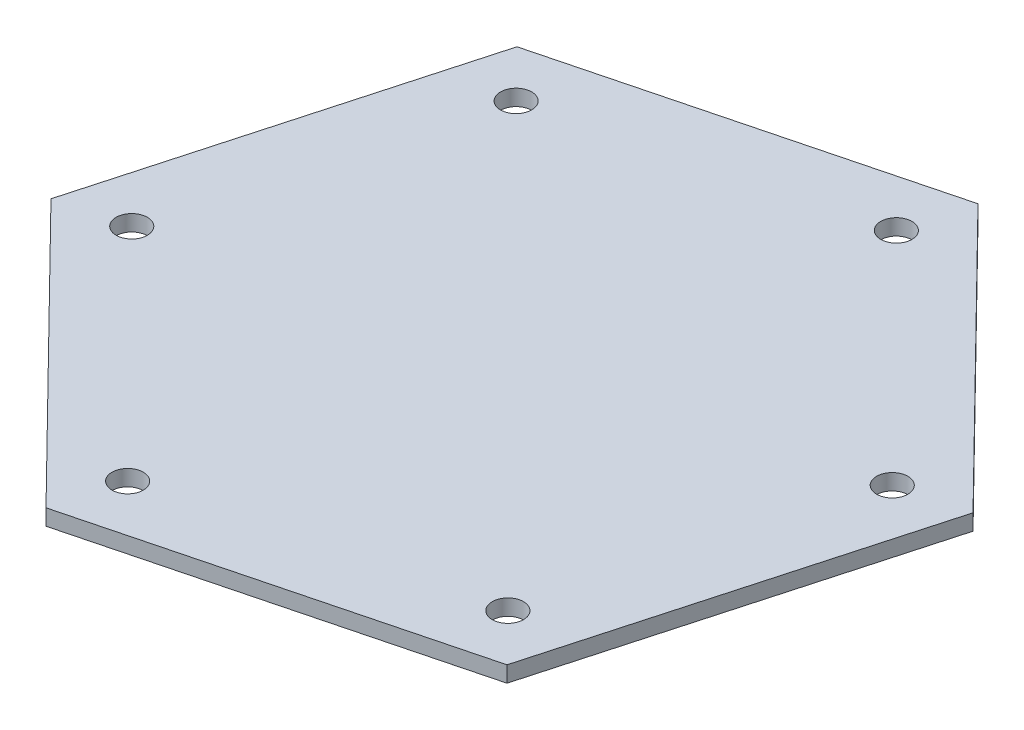
ISO-10303-21;
HEADER;
FILE_DESCRIPTION(('STEP AP214'),'2;1');
FILE_NAME('part.step','',(''),(''),'','','');
FILE_SCHEMA(('AUTOMOTIVE_DESIGN { 1 0 10303 214 1 1 1 1 }'));
ENDSEC;
DATA;
#1=APPLICATION_CONTEXT('core data for automotive mechanical design processes');
#2=APPLICATION_PROTOCOL_DEFINITION('international standard','automotive_design',2000,#1);
#3=PRODUCT_CONTEXT('',#1,'mechanical');
#4=PRODUCT('Part','Part','',(#3));
#5=PRODUCT_RELATED_PRODUCT_CATEGORY('part','',(#4));
#6=PRODUCT_DEFINITION_FORMATION('','',#4);
#7=PRODUCT_DEFINITION_CONTEXT('part definition',#1,'design');
#8=PRODUCT_DEFINITION('design','',#6,#7);
#9=PRODUCT_DEFINITION_SHAPE('','',#8);
#10=(LENGTH_UNIT() NAMED_UNIT(*) SI_UNIT(.MILLI.,.METRE.));
#11=(NAMED_UNIT(*) PLANE_ANGLE_UNIT() SI_UNIT($,.RADIAN.));
#12=(NAMED_UNIT(*) SI_UNIT($,.STERADIAN.) SOLID_ANGLE_UNIT());
#13=UNCERTAINTY_MEASURE_WITH_UNIT(LENGTH_MEASURE(1.E-05),#10,'distance_accuracy_value','');
#14=(GEOMETRIC_REPRESENTATION_CONTEXT(3) GLOBAL_UNCERTAINTY_ASSIGNED_CONTEXT((#13)) GLOBAL_UNIT_ASSIGNED_CONTEXT((#10,
#11,#12)) REPRESENTATION_CONTEXT('',''));
#15=CARTESIAN_POINT('',(0.,0.,0.));
#16=DIRECTION('',(0.,0.,1.));
#17=DIRECTION('',(1.,0.,0.));
#18=AXIS2_PLACEMENT_3D('',#15,#16,#17);
#19=CARTESIAN_POINT('',(-8.24691095097219,1.3,29.6710913140507));
#20=DIRECTION('',(-0.249822879818475,0.,-0.968291551506675));
#21=DIRECTION('',(-0.968291551506675,0.,0.249822879818475));
#22=AXIS2_PLACEMENT_3D('',#19,#20,#21);
#23=PLANE('',#22);
#24=DIRECTION('',(0.968291551506675,0.,-0.249822879818475));
#25=VECTOR('',#24,1.);
#26=CARTESIAN_POINT('',(-8.24691095097219,0.,29.6710913140507));
#27=LINE('',#26,#25);
#28=CARTESIAN_POINT('',(-8.24691095097219,0.,29.6710913140507));
#29=VERTEX_POINT('',#28);
#30=CARTESIAN_POINT('',(21.5724633604896,0.,21.9775800433153));
#31=VERTEX_POINT('',#30);
#32=EDGE_CURVE('E118',#29,#31,#27,.T.);
#33=ORIENTED_EDGE('',*,*,#32,.T.);
#34=DIRECTION('',(0.,-1.,0.));
#35=VECTOR('',#34,1.);
#36=CARTESIAN_POINT('',(21.5724633604896,1.3,21.9775800433153));
#37=LINE('',#36,#35);
#38=CARTESIAN_POINT('',(21.5724633604896,1.3,21.9775800433153));
#39=VERTEX_POINT('',#38);
#40=EDGE_CURVE('E11',#39,#31,#37,.T.);
#41=ORIENTED_EDGE('',*,*,#40,.F.);
#42=DIRECTION('',(0.968291551506675,0.,-0.249822879818475));
#43=VECTOR('',#42,1.);
#44=CARTESIAN_POINT('',(-8.24691095097219,1.3,29.6710913140507));
#45=LINE('',#44,#43);
#46=CARTESIAN_POINT('',(-8.24691095097219,1.3,29.6710913140507));
#47=VERTEX_POINT('',#46);
#48=EDGE_CURVE('E129',#47,#39,#45,.T.);
#49=ORIENTED_EDGE('',*,*,#48,.F.);
#50=DIRECTION('',(0.,-1.,0.));
#51=VECTOR('',#50,1.);
#52=CARTESIAN_POINT('',(-8.24691095097219,1.3,29.6710913140507));
#53=LINE('',#52,#51);
#54=EDGE_CURVE('E114',#47,#29,#53,.T.);
#55=ORIENTED_EDGE('',*,*,#54,.T.);
#56=EDGE_LOOP('',(#33,#41,#49,#55));
#57=FACE_BOUND('',#56,.T.);
#58=ADVANCED_FACE('F34',(#57),#23,.F.);
#59=CARTESIAN_POINT('',(21.5724633604896,1.3,21.9775800433153));
#60=DIRECTION('',(-0.963476521783866,0.,-0.267792815383952));
#61=DIRECTION('',(-0.267792815383952,0.,0.963476521783866));
#62=AXIS2_PLACEMENT_3D('',#59,#60,#61);
#63=PLANE('',#62);
#64=DIRECTION('',(0.267792815383952,0.,-0.963476521783866));
#65=VECTOR('',#64,1.);
#66=CARTESIAN_POINT('',(21.5724633604896,0.,21.9775800433153));
#67=LINE('',#66,#65);
#68=CARTESIAN_POINT('',(29.8193743114618,0.,-7.69351127073536));
#69=VERTEX_POINT('',#68);
#70=EDGE_CURVE('E121',#31,#69,#67,.T.);
#71=ORIENTED_EDGE('',*,*,#70,.T.);
#72=DIRECTION('',(0.,-1.,0.));
#73=VECTOR('',#72,1.);
#74=CARTESIAN_POINT('',(29.8193743114618,1.3,-7.69351127073536));
#75=LINE('',#74,#73);
#76=CARTESIAN_POINT('',(29.8193743114618,1.3,-7.69351127073536));
#77=VERTEX_POINT('',#76);
#78=EDGE_CURVE('E42',#77,#69,#75,.T.);
#79=ORIENTED_EDGE('',*,*,#78,.F.);
#80=DIRECTION('',(0.267792815383952,0.,-0.963476521783866));
#81=VECTOR('',#80,1.);
#82=CARTESIAN_POINT('',(21.5724633604896,1.3,21.9775800433153));
#83=LINE('',#82,#81);
#84=EDGE_CURVE('E87',#39,#77,#83,.T.);
#85=ORIENTED_EDGE('',*,*,#84,.F.);
#86=ORIENTED_EDGE('',*,*,#40,.T.);
#87=EDGE_LOOP('',(#71,#79,#85,#86));
#88=FACE_BOUND('',#87,.T.);
#89=ADVANCED_FACE('F154',(#88),#63,.F.);
#90=CARTESIAN_POINT('',(29.8193743114618,1.3,-7.69351127073536));
#91=DIRECTION('',(-0.713653641965391,0.,0.700498736122723));
#92=DIRECTION('',(0.700498736122723,0.,0.713653641965391));
#93=AXIS2_PLACEMENT_3D('',#90,#91,#92);
#94=PLANE('',#93);
#95=DIRECTION('',(-0.700498736122723,0.,-0.713653641965391));
#96=VECTOR('',#95,1.);
#97=CARTESIAN_POINT('',(29.8193743114618,0.,-7.69351127073536));
#98=LINE('',#97,#96);
#99=CARTESIAN_POINT('',(8.24691095097219,0.,-29.6710913140507));
#100=VERTEX_POINT('',#99);
#101=EDGE_CURVE('E124',#69,#100,#98,.T.);
#102=ORIENTED_EDGE('',*,*,#101,.T.);
#103=DIRECTION('',(0.,-1.,0.));
#104=VECTOR('',#103,1.);
#105=CARTESIAN_POINT('',(8.24691095097219,1.3,-29.6710913140507));
#106=LINE('',#105,#104);
#107=CARTESIAN_POINT('',(8.24691095097219,1.3,-29.6710913140507));
#108=VERTEX_POINT('',#107);
#109=EDGE_CURVE('E109',#108,#100,#106,.T.);
#110=ORIENTED_EDGE('',*,*,#109,.F.);
#111=DIRECTION('',(-0.700498736122723,0.,-0.713653641965391));
#112=VECTOR('',#111,1.);
#113=CARTESIAN_POINT('',(29.8193743114618,1.3,-7.69351127073536));
#114=LINE('',#113,#112);
#115=EDGE_CURVE('E100',#77,#108,#114,.T.);
#116=ORIENTED_EDGE('',*,*,#115,.F.);
#117=ORIENTED_EDGE('',*,*,#78,.T.);
#118=EDGE_LOOP('',(#102,#110,#116,#117));
#119=FACE_BOUND('',#118,.T.);
#120=ADVANCED_FACE('F135',(#119),#94,.F.);
#121=CARTESIAN_POINT('',(8.24691095097219,1.3,-29.6710913140507));
#122=DIRECTION('',(0.249822879818475,0.,0.968291551506675));
#123=DIRECTION('',(0.968291551506675,0.,-0.249822879818475));
#124=AXIS2_PLACEMENT_3D('',#121,#122,#123);
#125=PLANE('',#124);
#126=DIRECTION('',(-0.968291551506675,0.,0.249822879818475));
#127=VECTOR('',#126,1.);
#128=CARTESIAN_POINT('',(8.24691095097219,0.,-29.6710913140507));
#129=LINE('',#128,#127);
#130=CARTESIAN_POINT('',(-21.5724633604896,0.,-21.9775800433153));
#131=VERTEX_POINT('',#130);
#132=EDGE_CURVE('E108',#100,#131,#129,.T.);
#133=ORIENTED_EDGE('',*,*,#132,.T.);
#134=DIRECTION('',(0.,-1.,0.));
#135=VECTOR('',#134,1.);
#136=CARTESIAN_POINT('',(-21.5724633604896,1.3,-21.9775800433153));
#137=LINE('',#136,#135);
#138=CARTESIAN_POINT('',(-21.5724633604896,1.3,-21.9775800433153));
#139=VERTEX_POINT('',#138);
#140=EDGE_CURVE('E105',#139,#131,#137,.T.);
#141=ORIENTED_EDGE('',*,*,#140,.F.);
#142=DIRECTION('',(-0.968291551506675,0.,0.249822879818475));
#143=VECTOR('',#142,1.);
#144=CARTESIAN_POINT('',(8.24691095097219,1.3,-29.6710913140507));
#145=LINE('',#144,#143);
#146=EDGE_CURVE('E94',#108,#139,#145,.T.);
#147=ORIENTED_EDGE('',*,*,#146,.F.);
#148=ORIENTED_EDGE('',*,*,#109,.T.);
#149=EDGE_LOOP('',(#133,#141,#147,#148));
#150=FACE_BOUND('',#149,.T.);
#151=ADVANCED_FACE('F106',(#150),#125,.F.);
#152=CARTESIAN_POINT('',(-21.5724633604896,1.3,-21.9775800433153));
#153=DIRECTION('',(0.963476521783866,0.,0.267792815383952));
#154=DIRECTION('',(0.267792815383952,0.,-0.963476521783866));
#155=AXIS2_PLACEMENT_3D('',#152,#153,#154);
#156=PLANE('',#155);
#157=DIRECTION('',(-0.267792815383952,0.,0.963476521783866));
#158=VECTOR('',#157,1.);
#159=CARTESIAN_POINT('',(-21.5724633604896,0.,-21.9775800433153));
#160=LINE('',#159,#158);
#161=CARTESIAN_POINT('',(-29.8193743114618,0.,7.69351127073536));
#162=VERTEX_POINT('',#161);
#163=EDGE_CURVE('E73',#131,#162,#160,.T.);
#164=ORIENTED_EDGE('',*,*,#163,.T.);
#165=DIRECTION('',(0.,-1.,0.));
#166=VECTOR('',#165,1.);
#167=CARTESIAN_POINT('',(-29.8193743114618,1.3,7.69351127073536));
#168=LINE('',#167,#166);
#169=CARTESIAN_POINT('',(-29.8193743114618,1.3,7.69351127073536));
#170=VERTEX_POINT('',#169);
#171=EDGE_CURVE('E110',#170,#162,#168,.T.);
#172=ORIENTED_EDGE('',*,*,#171,.F.);
#173=DIRECTION('',(-0.267792815383952,0.,0.963476521783866));
#174=VECTOR('',#173,1.);
#175=CARTESIAN_POINT('',(-21.5724633604896,1.3,-21.9775800433153));
#176=LINE('',#175,#174);
#177=EDGE_CURVE('E98',#139,#170,#176,.T.);
#178=ORIENTED_EDGE('',*,*,#177,.F.);
#179=ORIENTED_EDGE('',*,*,#140,.T.);
#180=EDGE_LOOP('',(#164,#172,#178,#179));
#181=FACE_BOUND('',#180,.T.);
#182=ADVANCED_FACE('F112',(#181),#156,.F.);
#183=CARTESIAN_POINT('',(-29.8193743114618,1.3,7.69351127073536));
#184=DIRECTION('',(0.713653641965392,0.,-0.700498736122723));
#185=DIRECTION('',(-0.700498736122723,0.,-0.713653641965392));
#186=AXIS2_PLACEMENT_3D('',#183,#184,#185);
#187=PLANE('',#186);
#188=DIRECTION('',(0.700498736122723,0.,0.713653641965392));
#189=VECTOR('',#188,1.);
#190=CARTESIAN_POINT('',(-29.8193743114618,0.,7.69351127073536));
#191=LINE('',#190,#189);
#192=EDGE_CURVE('E79',#162,#29,#191,.T.);
#193=ORIENTED_EDGE('',*,*,#192,.T.);
#194=ORIENTED_EDGE('',*,*,#54,.F.);
#195=DIRECTION('',(0.700498736122723,0.,0.713653641965392));
#196=VECTOR('',#195,1.);
#197=CARTESIAN_POINT('',(-29.8193743114618,1.3,7.69351127073536));
#198=LINE('',#197,#196);
#199=EDGE_CURVE('E50',#170,#47,#198,.T.);
#200=ORIENTED_EDGE('',*,*,#199,.F.);
#201=ORIENTED_EDGE('',*,*,#171,.T.);
#202=EDGE_LOOP('',(#193,#194,#200,#201));
#203=FACE_BOUND('',#202,.T.);
#204=ADVANCED_FACE('F142',(#203),#187,.F.);
#205=CARTESIAN_POINT('',(0.,1.3,0.));
#206=DIRECTION('',(0.,1.,0.));
#207=DIRECTION('',(0.,0.,1.));
#208=AXIS2_PLACEMENT_3D('',#205,#206,#207);
#209=PLANE('',#208);
#210=CARTESIAN_POINT('',(24.5946054082706,1.3,-6.34550114739025));
#211=DIRECTION('',(0.,1.,0.));
#212=DIRECTION('',(0.,0.,1.));
#213=AXIS2_PLACEMENT_3D('',#210,#211,#212);
#214=CIRCLE('',#213,1.26999999999999);
#215=CARTESIAN_POINT('',(24.5946054082706,1.3,-5.07550114739026));
#216=VERTEX_POINT('',#215);
#217=EDGE_CURVE('E257',#216,#216,#214,.T.);
#218=ORIENTED_EDGE('',*,*,#217,.F.);
#219=EDGE_LOOP('',(#218));
#220=FACE_BOUND('',#219,.T.);
#221=CARTESIAN_POINT('',(17.7926678975196,1.3,18.1268025059203));
#222=DIRECTION('',(0.,1.,0.));
#223=DIRECTION('',(0.,0.,1.));
#224=AXIS2_PLACEMENT_3D('',#221,#222,#223);
#225=CIRCLE('',#224,1.27000000000124);
#226=CARTESIAN_POINT('',(17.7926678975196,1.3,19.3968025059216));
#227=VERTEX_POINT('',#226);
#228=EDGE_CURVE('E261',#227,#227,#225,.T.);
#229=ORIENTED_EDGE('',*,*,#228,.F.);
#230=EDGE_LOOP('',(#229));
#231=FACE_BOUND('',#230,.T.);
#232=CARTESIAN_POINT('',(-6.80193751074963,1.3,24.472303653311));
#233=DIRECTION('',(0.,1.,0.));
#234=DIRECTION('',(0.,0.,1.));
#235=AXIS2_PLACEMENT_3D('',#232,#233,#234);
#236=CIRCLE('',#235,1.27000000000255);
#237=CARTESIAN_POINT('',(-6.80193751074963,1.3,25.7423036533135));
#238=VERTEX_POINT('',#237);
#239=EDGE_CURVE('E271',#238,#238,#236,.T.);
#240=ORIENTED_EDGE('',*,*,#239,.F.);
#241=EDGE_LOOP('',(#240));
#242=FACE_BOUND('',#241,.T.);
#243=CARTESIAN_POINT('',(-24.5946054082678,1.3,6.34550114739103));
#244=DIRECTION('',(0.,1.,0.));
#245=DIRECTION('',(0.,0.,1.));
#246=AXIS2_PLACEMENT_3D('',#243,#244,#245);
#247=CIRCLE('',#246,1.27000000000267);
#248=CARTESIAN_POINT('',(-24.5946054082678,1.3,7.6155011473937));
#249=VERTEX_POINT('',#248);
#250=EDGE_CURVE('E277',#249,#249,#247,.T.);
#251=ORIENTED_EDGE('',*,*,#250,.F.);
#252=EDGE_LOOP('',(#251));
#253=FACE_BOUND('',#252,.T.);
#254=CARTESIAN_POINT('',(-17.7926678975168,1.3,-18.1268025059196));
#255=DIRECTION('',(0.,1.,0.));
#256=DIRECTION('',(0.,0.,1.));
#257=AXIS2_PLACEMENT_3D('',#254,#255,#256);
#258=CIRCLE('',#257,1.27000000000153);
#259=CARTESIAN_POINT('',(-17.7926678975168,1.3,-16.856802505918));
#260=VERTEX_POINT('',#259);
#261=EDGE_CURVE('E283',#260,#260,#258,.T.);
#262=ORIENTED_EDGE('',*,*,#261,.F.);
#263=EDGE_LOOP('',(#262));
#264=FACE_BOUND('',#263,.T.);
#265=CARTESIAN_POINT('',(6.80193751075238,1.3,-24.4723036533102));
#266=DIRECTION('',(0.,1.,0.));
#267=DIRECTION('',(0.,0.,1.));
#268=AXIS2_PLACEMENT_3D('',#265,#266,#267);
#269=CIRCLE('',#268,1.27);
#270=CARTESIAN_POINT('',(6.80193751075238,1.3,-23.2023036533102));
#271=VERTEX_POINT('',#270);
#272=EDGE_CURVE('E122',#271,#271,#269,.T.);
#273=ORIENTED_EDGE('',*,*,#272,.F.);
#274=EDGE_LOOP('',(#273));
#275=FACE_BOUND('',#274,.T.);
#276=ORIENTED_EDGE('',*,*,#48,.T.);
#277=ORIENTED_EDGE('',*,*,#84,.T.);
#278=ORIENTED_EDGE('',*,*,#115,.T.);
#279=ORIENTED_EDGE('',*,*,#146,.T.);
#280=ORIENTED_EDGE('',*,*,#177,.T.);
#281=ORIENTED_EDGE('',*,*,#199,.T.);
#282=EDGE_LOOP('',(#276,#277,#278,#279,#280,#281));
#283=FACE_BOUND('',#282,.T.);
#284=ADVANCED_FACE('F96',(#220,#231,#242,#253,#264,#275,#283),#209,.T.);
#285=CARTESIAN_POINT('',(0.,0.,0.));
#286=DIRECTION('',(0.,1.,0.));
#287=DIRECTION('',(0.,0.,1.));
#288=AXIS2_PLACEMENT_3D('',#285,#286,#287);
#289=PLANE('',#288);
#290=CARTESIAN_POINT('',(24.5946054082706,0.,-6.34550114739025));
#291=DIRECTION('',(0.,1.,0.));
#292=DIRECTION('',(0.,0.,1.));
#293=AXIS2_PLACEMENT_3D('',#290,#291,#292);
#294=CIRCLE('',#293,1.26999999999999);
#295=CARTESIAN_POINT('',(24.5946054082706,0.,-5.07550114739026));
#296=VERTEX_POINT('',#295);
#297=EDGE_CURVE('E260',#296,#296,#294,.T.);
#298=ORIENTED_EDGE('',*,*,#297,.T.);
#299=EDGE_LOOP('',(#298));
#300=FACE_BOUND('',#299,.T.);
#301=CARTESIAN_POINT('',(17.7926678975196,0.,18.1268025059203));
#302=DIRECTION('',(0.,1.,0.));
#303=DIRECTION('',(0.,0.,1.));
#304=AXIS2_PLACEMENT_3D('',#301,#302,#303);
#305=CIRCLE('',#304,1.27000000000124);
#306=CARTESIAN_POINT('',(17.7926678975196,0.,19.3968025059216));
#307=VERTEX_POINT('',#306);
#308=EDGE_CURVE('E266',#307,#307,#305,.T.);
#309=ORIENTED_EDGE('',*,*,#308,.T.);
#310=EDGE_LOOP('',(#309));
#311=FACE_BOUND('',#310,.T.);
#312=CARTESIAN_POINT('',(-6.80193751074963,0.,24.472303653311));
#313=DIRECTION('',(0.,1.,0.));
#314=DIRECTION('',(0.,0.,1.));
#315=AXIS2_PLACEMENT_3D('',#312,#313,#314);
#316=CIRCLE('',#315,1.27000000000255);
#317=CARTESIAN_POINT('',(-6.80193751074963,0.,25.7423036533135));
#318=VERTEX_POINT('',#317);
#319=EDGE_CURVE('E274',#318,#318,#316,.T.);
#320=ORIENTED_EDGE('',*,*,#319,.T.);
#321=EDGE_LOOP('',(#320));
#322=FACE_BOUND('',#321,.T.);
#323=CARTESIAN_POINT('',(-24.5946054082678,0.,6.34550114739103));
#324=DIRECTION('',(0.,1.,0.));
#325=DIRECTION('',(0.,0.,1.));
#326=AXIS2_PLACEMENT_3D('',#323,#324,#325);
#327=CIRCLE('',#326,1.27000000000267);
#328=CARTESIAN_POINT('',(-24.5946054082678,0.,7.6155011473937));
#329=VERTEX_POINT('',#328);
#330=EDGE_CURVE('E280',#329,#329,#327,.T.);
#331=ORIENTED_EDGE('',*,*,#330,.T.);
#332=EDGE_LOOP('',(#331));
#333=FACE_BOUND('',#332,.T.);
#334=CARTESIAN_POINT('',(-17.7926678975168,0.,-18.1268025059196));
#335=DIRECTION('',(0.,1.,0.));
#336=DIRECTION('',(0.,0.,1.));
#337=AXIS2_PLACEMENT_3D('',#334,#335,#336);
#338=CIRCLE('',#337,1.27000000000153);
#339=CARTESIAN_POINT('',(-17.7926678975168,0.,-16.856802505918));
#340=VERTEX_POINT('',#339);
#341=EDGE_CURVE('E286',#340,#340,#338,.T.);
#342=ORIENTED_EDGE('',*,*,#341,.T.);
#343=EDGE_LOOP('',(#342));
#344=FACE_BOUND('',#343,.T.);
#345=CARTESIAN_POINT('',(6.80193751075238,0.,-24.4723036533102));
#346=DIRECTION('',(0.,1.,0.));
#347=DIRECTION('',(0.,0.,1.));
#348=AXIS2_PLACEMENT_3D('',#345,#346,#347);
#349=CIRCLE('',#348,1.27);
#350=CARTESIAN_POINT('',(6.80193751075238,0.,-23.2023036533102));
#351=VERTEX_POINT('',#350);
#352=EDGE_CURVE('E263',#351,#351,#349,.T.);
#353=ORIENTED_EDGE('',*,*,#352,.T.);
#354=EDGE_LOOP('',(#353));
#355=FACE_BOUND('',#354,.T.);
#356=ORIENTED_EDGE('',*,*,#32,.F.);
#357=ORIENTED_EDGE('',*,*,#192,.F.);
#358=ORIENTED_EDGE('',*,*,#163,.F.);
#359=ORIENTED_EDGE('',*,*,#132,.F.);
#360=ORIENTED_EDGE('',*,*,#101,.F.);
#361=ORIENTED_EDGE('',*,*,#70,.F.);
#362=EDGE_LOOP('',(#356,#357,#358,#359,#360,#361));
#363=FACE_BOUND('',#362,.T.);
#364=ADVANCED_FACE('F138',(#300,#311,#322,#333,#344,#355,#363),#289,.F.);
#365=CARTESIAN_POINT('',(6.80193751075238,1.3,-24.4723036533102));
#366=DIRECTION('',(0.,-1.,0.));
#367=DIRECTION('',(0.,0.,-1.));
#368=AXIS2_PLACEMENT_3D('',#365,#366,#367);
#369=CYLINDRICAL_SURFACE('',#368,1.27);
#370=ORIENTED_EDGE('',*,*,#272,.T.);
#371=EDGE_LOOP('',(#370));
#372=FACE_BOUND('',#371,.T.);
#373=ORIENTED_EDGE('',*,*,#352,.F.);
#374=EDGE_LOOP('',(#373));
#375=FACE_BOUND('',#374,.T.);
#376=ADVANCED_FACE('F191',(#372,#375),#369,.F.);
#377=CARTESIAN_POINT('',(-17.7926678975168,1.3,-18.1268025059196));
#378=DIRECTION('',(0.,-1.,0.));
#379=DIRECTION('',(0.,0.,-1.));
#380=AXIS2_PLACEMENT_3D('',#377,#378,#379);
#381=CYLINDRICAL_SURFACE('',#380,1.27000000000153);
#382=ORIENTED_EDGE('',*,*,#261,.T.);
#383=EDGE_LOOP('',(#382));
#384=FACE_BOUND('',#383,.T.);
#385=ORIENTED_EDGE('',*,*,#341,.F.);
#386=EDGE_LOOP('',(#385));
#387=FACE_BOUND('',#386,.T.);
#388=ADVANCED_FACE('F200',(#384,#387),#381,.F.);
#389=CARTESIAN_POINT('',(-24.5946054082678,1.3,6.34550114739103));
#390=DIRECTION('',(0.,-1.,0.));
#391=DIRECTION('',(0.,0.,-1.));
#392=AXIS2_PLACEMENT_3D('',#389,#390,#391);
#393=CYLINDRICAL_SURFACE('',#392,1.27000000000267);
#394=ORIENTED_EDGE('',*,*,#250,.T.);
#395=EDGE_LOOP('',(#394));
#396=FACE_BOUND('',#395,.T.);
#397=ORIENTED_EDGE('',*,*,#330,.F.);
#398=EDGE_LOOP('',(#397));
#399=FACE_BOUND('',#398,.T.);
#400=ADVANCED_FACE('F210',(#396,#399),#393,.F.);
#401=CARTESIAN_POINT('',(-6.80193751074963,1.3,24.472303653311));
#402=DIRECTION('',(0.,-1.,0.));
#403=DIRECTION('',(0.,0.,-1.));
#404=AXIS2_PLACEMENT_3D('',#401,#402,#403);
#405=CYLINDRICAL_SURFACE('',#404,1.27000000000255);
#406=ORIENTED_EDGE('',*,*,#239,.T.);
#407=EDGE_LOOP('',(#406));
#408=FACE_BOUND('',#407,.T.);
#409=ORIENTED_EDGE('',*,*,#319,.F.);
#410=EDGE_LOOP('',(#409));
#411=FACE_BOUND('',#410,.T.);
#412=ADVANCED_FACE('F220',(#408,#411),#405,.F.);
#413=CARTESIAN_POINT('',(17.7926678975196,1.3,18.1268025059203));
#414=DIRECTION('',(0.,-1.,0.));
#415=DIRECTION('',(0.,0.,-1.));
#416=AXIS2_PLACEMENT_3D('',#413,#414,#415);
#417=CYLINDRICAL_SURFACE('',#416,1.27000000000124);
#418=ORIENTED_EDGE('',*,*,#228,.T.);
#419=EDGE_LOOP('',(#418));
#420=FACE_BOUND('',#419,.T.);
#421=ORIENTED_EDGE('',*,*,#308,.F.);
#422=EDGE_LOOP('',(#421));
#423=FACE_BOUND('',#422,.T.);
#424=ADVANCED_FACE('F230',(#420,#423),#417,.F.);
#425=CARTESIAN_POINT('',(24.5946054082706,1.3,-6.34550114739025));
#426=DIRECTION('',(0.,-1.,0.));
#427=DIRECTION('',(0.,0.,-1.));
#428=AXIS2_PLACEMENT_3D('',#425,#426,#427);
#429=CYLINDRICAL_SURFACE('',#428,1.26999999999999);
#430=ORIENTED_EDGE('',*,*,#217,.T.);
#431=EDGE_LOOP('',(#430));
#432=FACE_BOUND('',#431,.T.);
#433=ORIENTED_EDGE('',*,*,#297,.F.);
#434=EDGE_LOOP('',(#433));
#435=FACE_BOUND('',#434,.T.);
#436=ADVANCED_FACE('F240',(#432,#435),#429,.F.);
#437=CLOSED_SHELL('',(#58,#89,#120,#151,#182,#204,#284,#364,#376,#388,#400,#412,#424,#436));
#438=MANIFOLD_SOLID_BREP('B2',#437);
#439=ADVANCED_BREP_SHAPE_REPRESENTATION('',(#18,#438),#14);
#440=SHAPE_DEFINITION_REPRESENTATION(#9,#439);
ENDSEC;
END-ISO-10303-21;
